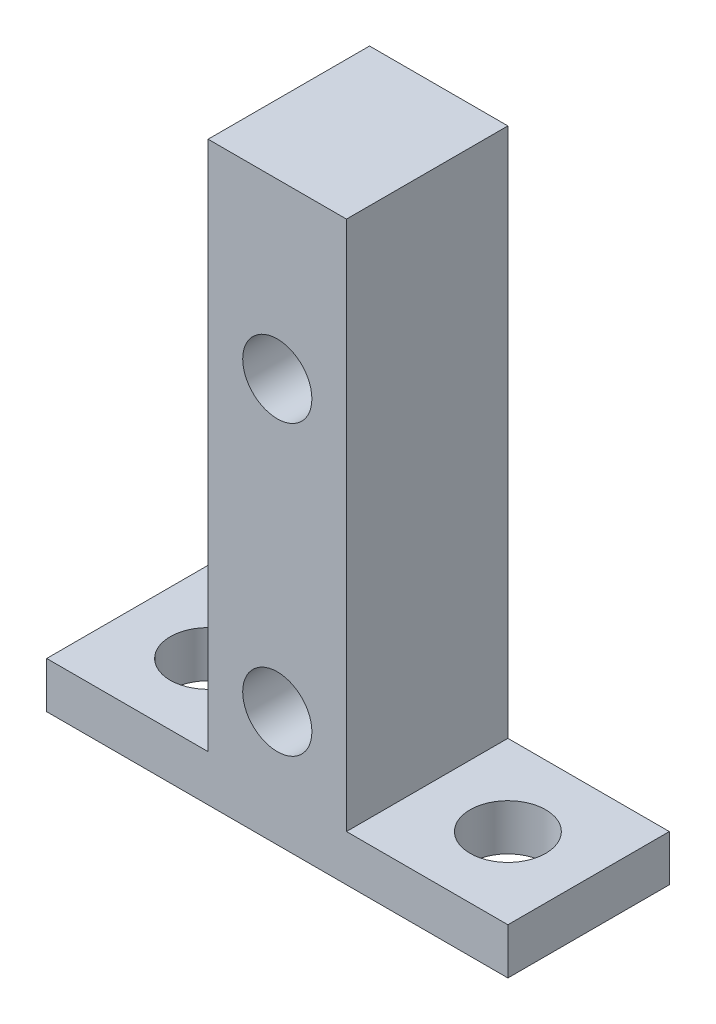
ISO-10303-21;
HEADER;
FILE_DESCRIPTION(('STEP AP214'),'2;1');
FILE_NAME('part.step','',(''),(''),'','','');
FILE_SCHEMA(('AUTOMOTIVE_DESIGN { 1 0 10303 214 1 1 1 1 }'));
ENDSEC;
DATA;
#1=APPLICATION_CONTEXT('core data for automotive mechanical design processes');
#2=APPLICATION_PROTOCOL_DEFINITION('international standard','automotive_design',2000,#1);
#3=PRODUCT_CONTEXT('',#1,'mechanical');
#4=PRODUCT('Part','Part','',(#3));
#5=PRODUCT_RELATED_PRODUCT_CATEGORY('part','',(#4));
#6=PRODUCT_DEFINITION_FORMATION('','',#4);
#7=PRODUCT_DEFINITION_CONTEXT('part definition',#1,'design');
#8=PRODUCT_DEFINITION('design','',#6,#7);
#9=PRODUCT_DEFINITION_SHAPE('','',#8);
#10=(LENGTH_UNIT() NAMED_UNIT(*) SI_UNIT(.MILLI.,.METRE.));
#11=(NAMED_UNIT(*) PLANE_ANGLE_UNIT() SI_UNIT($,.RADIAN.));
#12=(NAMED_UNIT(*) SI_UNIT($,.STERADIAN.) SOLID_ANGLE_UNIT());
#13=UNCERTAINTY_MEASURE_WITH_UNIT(LENGTH_MEASURE(1.E-05),#10,'distance_accuracy_value','');
#14=(GEOMETRIC_REPRESENTATION_CONTEXT(3) GLOBAL_UNCERTAINTY_ASSIGNED_CONTEXT((#13)) GLOBAL_UNIT_ASSIGNED_CONTEXT((#10,
#11,#12)) REPRESENTATION_CONTEXT('',''));
#15=CARTESIAN_POINT('',(0.,0.,0.));
#16=DIRECTION('',(0.,0.,1.));
#17=DIRECTION('',(1.,0.,0.));
#18=AXIS2_PLACEMENT_3D('',#15,#16,#17);
#19=CARTESIAN_POINT('',(-32.623125,3.175,0.));
#20=DIRECTION('',(0.,1.,0.));
#21=DIRECTION('',(0.,0.,1.));
#22=AXIS2_PLACEMENT_3D('',#19,#20,#21);
#23=PLANE('',#22);
#24=CARTESIAN_POINT('',(10.874375,3.175,26.67));
#25=DIRECTION('',(0.,1.,0.));
#26=DIRECTION('',(0.,0.,1.));
#27=AXIS2_PLACEMENT_3D('',#24,#25,#26);
#28=CIRCLE('',#27,2.0828);
#29=CARTESIAN_POINT('',(10.874375,3.175,28.7528));
#30=VERTEX_POINT('',#29);
#31=EDGE_CURVE('E11',#30,#30,#28,.F.);
#32=ORIENTED_EDGE('',*,*,#31,.F.);
#33=EDGE_LOOP('',(#32));
#34=FACE_BOUND('',#33,.T.);
#35=CARTESIAN_POINT('',(27.3843750000001,3.175,26.67));
#36=DIRECTION('',(0.,1.,0.));
#37=DIRECTION('',(0.,0.,1.));
#38=AXIS2_PLACEMENT_3D('',#35,#36,#37);
#39=CIRCLE('',#38,2.0828);
#40=CARTESIAN_POINT('',(27.3843750000001,3.175,28.7528));
#41=VERTEX_POINT('',#40);
#42=EDGE_CURVE('E43',#41,#41,#39,.F.);
#43=ORIENTED_EDGE('',*,*,#42,.F.);
#44=EDGE_LOOP('',(#43));
#45=FACE_BOUND('',#44,.T.);
#46=DIRECTION('',(1.,0.,0.));
#47=VECTOR('',#46,1.);
#48=CARTESIAN_POINT('',(22.939375,3.175,31.115));
#49=LINE('',#48,#47);
#50=CARTESIAN_POINT('',(6.42937500000001,3.175,31.115));
#51=VERTEX_POINT('',#50);
#52=CARTESIAN_POINT('',(31.829375,3.175,31.115));
#53=VERTEX_POINT('',#52);
#54=EDGE_CURVE('E142',#51,#53,#49,.T.);
#55=ORIENTED_EDGE('',*,*,#54,.F.);
#56=DIRECTION('',(0.,0.,1.));
#57=VECTOR('',#56,1.);
#58=CARTESIAN_POINT('',(6.42937500000001,3.175,31.115));
#59=LINE('',#58,#57);
#60=CARTESIAN_POINT('',(6.42937500000001,3.175,22.225));
#61=VERTEX_POINT('',#60);
#62=EDGE_CURVE('E121',#61,#51,#59,.T.);
#63=ORIENTED_EDGE('',*,*,#62,.F.);
#64=DIRECTION('',(-1.,0.,0.));
#65=VECTOR('',#64,1.);
#66=CARTESIAN_POINT('',(22.939375,3.175,22.225));
#67=LINE('',#66,#65);
#68=CARTESIAN_POINT('',(31.829375,3.175,22.225));
#69=VERTEX_POINT('',#68);
#70=EDGE_CURVE('E147',#69,#61,#67,.T.);
#71=ORIENTED_EDGE('',*,*,#70,.F.);
#72=DIRECTION('',(0.,0.,-1.));
#73=VECTOR('',#72,1.);
#74=CARTESIAN_POINT('',(31.829375,3.175,31.115));
#75=LINE('',#74,#73);
#76=EDGE_CURVE('E117',#53,#69,#75,.T.);
#77=ORIENTED_EDGE('',*,*,#76,.F.);
#78=EDGE_LOOP('',(#55,#63,#71,#77));
#79=FACE_BOUND('',#78,.T.);
#80=ADVANCED_FACE('F36',(#34,#45,#79),#23,.F.);
#81=CARTESIAN_POINT('',(0.,34.925,0.));
#82=DIRECTION('',(0.,1.,0.));
#83=DIRECTION('',(0.,0.,1.));
#84=AXIS2_PLACEMENT_3D('',#81,#82,#83);
#85=PLANE('',#84);
#86=DIRECTION('',(0.,0.,1.));
#87=VECTOR('',#86,1.);
#88=CARTESIAN_POINT('',(15.319375,34.925,31.115));
#89=LINE('',#88,#87);
#90=CARTESIAN_POINT('',(15.319375,34.925,22.225));
#91=VERTEX_POINT('',#90);
#92=CARTESIAN_POINT('',(15.319375,34.925,31.115));
#93=VERTEX_POINT('',#92);
#94=EDGE_CURVE('E143',#91,#93,#89,.T.);
#95=ORIENTED_EDGE('',*,*,#94,.T.);
#96=DIRECTION('',(1.,0.,0.));
#97=VECTOR('',#96,1.);
#98=CARTESIAN_POINT('',(22.939375,34.925,31.115));
#99=LINE('',#98,#97);
#100=CARTESIAN_POINT('',(22.939375,34.925,31.115));
#101=VERTEX_POINT('',#100);
#102=EDGE_CURVE('E146',#93,#101,#99,.T.);
#103=ORIENTED_EDGE('',*,*,#102,.T.);
#104=DIRECTION('',(0.,0.,-1.));
#105=VECTOR('',#104,1.);
#106=CARTESIAN_POINT('',(22.939375,34.925,31.115));
#107=LINE('',#106,#105);
#108=CARTESIAN_POINT('',(22.939375,34.925,22.225));
#109=VERTEX_POINT('',#108);
#110=EDGE_CURVE('E149',#101,#109,#107,.T.);
#111=ORIENTED_EDGE('',*,*,#110,.T.);
#112=DIRECTION('',(-1.,0.,0.));
#113=VECTOR('',#112,1.);
#114=CARTESIAN_POINT('',(22.939375,34.925,22.225));
#115=LINE('',#114,#113);
#116=EDGE_CURVE('E151',#109,#91,#115,.T.);
#117=ORIENTED_EDGE('',*,*,#116,.T.);
#118=EDGE_LOOP('',(#95,#103,#111,#117));
#119=FACE_BOUND('',#118,.T.);
#120=ADVANCED_FACE('F182',(#119),#85,.T.);
#121=CARTESIAN_POINT('',(15.319375,34.925,31.115));
#122=DIRECTION('',(1.,0.,0.));
#123=DIRECTION('',(0.,0.,-1.));
#124=AXIS2_PLACEMENT_3D('',#121,#122,#123);
#125=PLANE('',#124);
#126=DIRECTION('',(0.,-1.,0.));
#127=VECTOR('',#126,1.);
#128=CARTESIAN_POINT('',(15.319375,34.925,22.225));
#129=LINE('',#128,#127);
#130=CARTESIAN_POINT('',(15.319375,5.715,22.225));
#131=VERTEX_POINT('',#130);
#132=EDGE_CURVE('E153',#91,#131,#129,.T.);
#133=ORIENTED_EDGE('',*,*,#132,.T.);
#134=DIRECTION('',(0.,0.,1.));
#135=VECTOR('',#134,1.);
#136=CARTESIAN_POINT('',(15.319375,5.715,31.115));
#137=LINE('',#136,#135);
#138=CARTESIAN_POINT('',(15.319375,5.715,31.115));
#139=VERTEX_POINT('',#138);
#140=EDGE_CURVE('E126',#131,#139,#137,.T.);
#141=ORIENTED_EDGE('',*,*,#140,.T.);
#142=DIRECTION('',(0.,-1.,0.));
#143=VECTOR('',#142,1.);
#144=CARTESIAN_POINT('',(15.319375,34.925,31.115));
#145=LINE('',#144,#143);
#146=EDGE_CURVE('E105',#93,#139,#145,.T.);
#147=ORIENTED_EDGE('',*,*,#146,.F.);
#148=ORIENTED_EDGE('',*,*,#94,.F.);
#149=EDGE_LOOP('',(#133,#141,#147,#148));
#150=FACE_BOUND('',#149,.T.);
#151=ADVANCED_FACE('F211',(#150),#125,.F.);
#152=CARTESIAN_POINT('',(22.939375,34.925,31.115));
#153=DIRECTION('',(-1.,0.,0.));
#154=DIRECTION('',(0.,0.,1.));
#155=AXIS2_PLACEMENT_3D('',#152,#153,#154);
#156=PLANE('',#155);
#157=DIRECTION('',(0.,-1.,0.));
#158=VECTOR('',#157,1.);
#159=CARTESIAN_POINT('',(22.939375,34.925,31.115));
#160=LINE('',#159,#158);
#161=CARTESIAN_POINT('',(22.939375,5.715,31.115));
#162=VERTEX_POINT('',#161);
#163=EDGE_CURVE('E161',#101,#162,#160,.T.);
#164=ORIENTED_EDGE('',*,*,#163,.T.);
#165=DIRECTION('',(0.,0.,-1.));
#166=VECTOR('',#165,1.);
#167=CARTESIAN_POINT('',(22.939375,5.715,31.115));
#168=LINE('',#167,#166);
#169=CARTESIAN_POINT('',(22.939375,5.715,22.225));
#170=VERTEX_POINT('',#169);
#171=EDGE_CURVE('E123',#162,#170,#168,.T.);
#172=ORIENTED_EDGE('',*,*,#171,.T.);
#173=DIRECTION('',(0.,-1.,0.));
#174=VECTOR('',#173,1.);
#175=CARTESIAN_POINT('',(22.939375,34.925,22.225));
#176=LINE('',#175,#174);
#177=EDGE_CURVE('E158',#109,#170,#176,.T.);
#178=ORIENTED_EDGE('',*,*,#177,.F.);
#179=ORIENTED_EDGE('',*,*,#110,.F.);
#180=EDGE_LOOP('',(#164,#172,#178,#179));
#181=FACE_BOUND('',#180,.T.);
#182=ADVANCED_FACE('F205',(#181),#156,.F.);
#183=CARTESIAN_POINT('',(19.129375,25.4,0.));
#184=DIRECTION('',(0.,0.,1.));
#185=DIRECTION('',(1.,0.,0.));
#186=AXIS2_PLACEMENT_3D('',#183,#184,#185);
#187=CYLINDRICAL_SURFACE('',#186,1.905);
#188=CARTESIAN_POINT('',(19.129375,25.4,22.225));
#189=DIRECTION('',(0.,0.,1.));
#190=DIRECTION('',(1.,0.,0.));
#191=AXIS2_PLACEMENT_3D('',#188,#189,#190);
#192=CIRCLE('',#191,1.905);
#193=CARTESIAN_POINT('',(21.034375,25.4,22.225));
#194=VERTEX_POINT('',#193);
#195=EDGE_CURVE('E134',#194,#194,#192,.T.);
#196=ORIENTED_EDGE('',*,*,#195,.F.);
#197=EDGE_LOOP('',(#196));
#198=FACE_BOUND('',#197,.T.);
#199=CARTESIAN_POINT('',(19.129375,25.4,31.115));
#200=DIRECTION('',(0.,0.,-1.));
#201=DIRECTION('',(-1.,0.,0.));
#202=AXIS2_PLACEMENT_3D('',#199,#200,#201);
#203=CIRCLE('',#202,1.905);
#204=CARTESIAN_POINT('',(17.224375,25.4,31.115));
#205=VERTEX_POINT('',#204);
#206=EDGE_CURVE('E135',#205,#205,#203,.T.);
#207=ORIENTED_EDGE('',*,*,#206,.F.);
#208=EDGE_LOOP('',(#207));
#209=FACE_BOUND('',#208,.T.);
#210=ADVANCED_FACE('F217',(#198,#209),#187,.F.);
#211=CARTESIAN_POINT('',(19.129375,9.525,0.));
#212=DIRECTION('',(0.,0.,1.));
#213=DIRECTION('',(1.,0.,0.));
#214=AXIS2_PLACEMENT_3D('',#211,#212,#213);
#215=CYLINDRICAL_SURFACE('',#214,1.905);
#216=CARTESIAN_POINT('',(19.129375,9.525,22.225));
#217=DIRECTION('',(0.,0.,1.));
#218=DIRECTION('',(1.,0.,0.));
#219=AXIS2_PLACEMENT_3D('',#216,#217,#218);
#220=CIRCLE('',#219,1.905);
#221=CARTESIAN_POINT('',(21.034375,9.525,22.225));
#222=VERTEX_POINT('',#221);
#223=EDGE_CURVE('E138',#222,#222,#220,.T.);
#224=ORIENTED_EDGE('',*,*,#223,.F.);
#225=EDGE_LOOP('',(#224));
#226=FACE_BOUND('',#225,.T.);
#227=CARTESIAN_POINT('',(19.129375,9.525,31.115));
#228=DIRECTION('',(0.,0.,-1.));
#229=DIRECTION('',(-1.,0.,0.));
#230=AXIS2_PLACEMENT_3D('',#227,#228,#229);
#231=CIRCLE('',#230,1.905);
#232=CARTESIAN_POINT('',(17.224375,9.525,31.115));
#233=VERTEX_POINT('',#232);
#234=EDGE_CURVE('E139',#233,#233,#231,.T.);
#235=ORIENTED_EDGE('',*,*,#234,.F.);
#236=EDGE_LOOP('',(#235));
#237=FACE_BOUND('',#236,.T.);
#238=ADVANCED_FACE('F230',(#226,#237),#215,.F.);
#239=CARTESIAN_POINT('',(0.,5.715,0.));
#240=DIRECTION('',(0.,1.,0.));
#241=DIRECTION('',(0.,0.,1.));
#242=AXIS2_PLACEMENT_3D('',#239,#240,#241);
#243=PLANE('',#242);
#244=CARTESIAN_POINT('',(27.3843750000001,5.715,26.67));
#245=DIRECTION('',(0.,1.,0.));
#246=DIRECTION('',(0.,0.,1.));
#247=AXIS2_PLACEMENT_3D('',#244,#245,#246);
#248=CIRCLE('',#247,2.0828);
#249=CARTESIAN_POINT('',(27.3843750000001,5.715,28.7528));
#250=VERTEX_POINT('',#249);
#251=EDGE_CURVE('E172',#250,#250,#248,.T.);
#252=ORIENTED_EDGE('',*,*,#251,.F.);
#253=EDGE_LOOP('',(#252));
#254=FACE_BOUND('',#253,.T.);
#255=ORIENTED_EDGE('',*,*,#171,.F.);
#256=DIRECTION('',(1.,0.,0.));
#257=VECTOR('',#256,1.);
#258=CARTESIAN_POINT('',(31.829375,5.715,31.115));
#259=LINE('',#258,#257);
#260=CARTESIAN_POINT('',(31.829375,5.715,31.115));
#261=VERTEX_POINT('',#260);
#262=EDGE_CURVE('E107',#162,#261,#259,.T.);
#263=ORIENTED_EDGE('',*,*,#262,.T.);
#264=DIRECTION('',(0.,0.,-1.));
#265=VECTOR('',#264,1.);
#266=CARTESIAN_POINT('',(31.829375,5.715,31.115));
#267=LINE('',#266,#265);
#268=CARTESIAN_POINT('',(31.829375,5.715,22.225));
#269=VERTEX_POINT('',#268);
#270=EDGE_CURVE('E106',#261,#269,#267,.T.);
#271=ORIENTED_EDGE('',*,*,#270,.T.);
#272=DIRECTION('',(-1.,0.,0.));
#273=VECTOR('',#272,1.);
#274=CARTESIAN_POINT('',(31.829375,5.715,22.225));
#275=LINE('',#274,#273);
#276=EDGE_CURVE('E58',#269,#170,#275,.T.);
#277=ORIENTED_EDGE('',*,*,#276,.T.);
#278=EDGE_LOOP('',(#255,#263,#271,#277));
#279=FACE_BOUND('',#278,.T.);
#280=ADVANCED_FACE('F207',(#254,#279),#243,.T.);
#281=CARTESIAN_POINT('',(27.3843750000001,-13.17625,26.67));
#282=DIRECTION('',(0.,1.,0.));
#283=DIRECTION('',(0.,0.,1.));
#284=AXIS2_PLACEMENT_3D('',#281,#282,#283);
#285=CYLINDRICAL_SURFACE('',#284,2.0828);
#286=ORIENTED_EDGE('',*,*,#42,.T.);
#287=EDGE_LOOP('',(#286));
#288=FACE_BOUND('',#287,.T.);
#289=ORIENTED_EDGE('',*,*,#251,.T.);
#290=EDGE_LOOP('',(#289));
#291=FACE_BOUND('',#290,.T.);
#292=ADVANCED_FACE('F177',(#288,#291),#285,.F.);
#293=CARTESIAN_POINT('',(22.939375,34.925,22.225));
#294=DIRECTION('',(0.,0.,1.));
#295=DIRECTION('',(1.,0.,0.));
#296=AXIS2_PLACEMENT_3D('',#293,#294,#295);
#297=PLANE('',#296);
#298=ORIENTED_EDGE('',*,*,#223,.T.);
#299=EDGE_LOOP('',(#298));
#300=FACE_BOUND('',#299,.T.);
#301=ORIENTED_EDGE('',*,*,#195,.T.);
#302=EDGE_LOOP('',(#301));
#303=FACE_BOUND('',#302,.T.);
#304=ORIENTED_EDGE('',*,*,#177,.T.);
#305=ORIENTED_EDGE('',*,*,#276,.F.);
#306=DIRECTION('',(0.,-1.,0.));
#307=VECTOR('',#306,1.);
#308=CARTESIAN_POINT('',(31.829375,5.715,22.225));
#309=LINE('',#308,#307);
#310=EDGE_CURVE('E129',#269,#69,#309,.T.);
#311=ORIENTED_EDGE('',*,*,#310,.T.);
#312=ORIENTED_EDGE('',*,*,#70,.T.);
#313=DIRECTION('',(0.,-1.,0.));
#314=VECTOR('',#313,1.);
#315=CARTESIAN_POINT('',(6.42937500000001,5.715,22.225));
#316=LINE('',#315,#314);
#317=CARTESIAN_POINT('',(6.42937500000001,5.715,22.225));
#318=VERTEX_POINT('',#317);
#319=EDGE_CURVE('E195',#318,#61,#316,.T.);
#320=ORIENTED_EDGE('',*,*,#319,.F.);
#321=EDGE_CURVE('E113',#131,#318,#275,.T.);
#322=ORIENTED_EDGE('',*,*,#321,.F.);
#323=ORIENTED_EDGE('',*,*,#132,.F.);
#324=ORIENTED_EDGE('',*,*,#116,.F.);
#325=EDGE_LOOP('',(#304,#305,#311,#312,#320,#322,#323,#324));
#326=FACE_BOUND('',#325,.T.);
#327=ADVANCED_FACE('F199',(#300,#303,#326),#297,.F.);
#328=CARTESIAN_POINT('',(10.874375,5.715,26.67));
#329=DIRECTION('',(0.,1.,0.));
#330=DIRECTION('',(0.,0.,1.));
#331=AXIS2_PLACEMENT_3D('',#328,#329,#330);
#332=CIRCLE('',#331,2.0828);
#333=CARTESIAN_POINT('',(10.874375,5.715,28.7528));
#334=VERTEX_POINT('',#333);
#335=EDGE_CURVE('E169',#334,#334,#332,.T.);
#336=ORIENTED_EDGE('',*,*,#335,.F.);
#337=EDGE_LOOP('',(#336));
#338=FACE_BOUND('',#337,.T.);
#339=ORIENTED_EDGE('',*,*,#140,.F.);
#340=ORIENTED_EDGE('',*,*,#321,.T.);
#341=DIRECTION('',(0.,0.,1.));
#342=VECTOR('',#341,1.);
#343=CARTESIAN_POINT('',(6.42937500000001,5.715,31.115));
#344=LINE('',#343,#342);
#345=CARTESIAN_POINT('',(6.42937500000001,5.715,31.115));
#346=VERTEX_POINT('',#345);
#347=EDGE_CURVE('E110',#318,#346,#344,.T.);
#348=ORIENTED_EDGE('',*,*,#347,.T.);
#349=EDGE_CURVE('E50',#346,#139,#259,.T.);
#350=ORIENTED_EDGE('',*,*,#349,.T.);
#351=EDGE_LOOP('',(#339,#340,#348,#350));
#352=FACE_BOUND('',#351,.T.);
#353=ADVANCED_FACE('F111',(#338,#352),#243,.T.);
#354=CARTESIAN_POINT('',(10.874375,-13.17625,26.67));
#355=DIRECTION('',(0.,1.,0.));
#356=DIRECTION('',(0.,0.,1.));
#357=AXIS2_PLACEMENT_3D('',#354,#355,#356);
#358=CYLINDRICAL_SURFACE('',#357,2.0828);
#359=ORIENTED_EDGE('',*,*,#31,.T.);
#360=EDGE_LOOP('',(#359));
#361=FACE_BOUND('',#360,.T.);
#362=ORIENTED_EDGE('',*,*,#335,.T.);
#363=EDGE_LOOP('',(#362));
#364=FACE_BOUND('',#363,.T.);
#365=ADVANCED_FACE('F222',(#361,#364),#358,.F.);
#366=CARTESIAN_POINT('',(22.939375,34.925,31.115));
#367=DIRECTION('',(0.,0.,-1.));
#368=DIRECTION('',(-1.,0.,0.));
#369=AXIS2_PLACEMENT_3D('',#366,#367,#368);
#370=PLANE('',#369);
#371=ORIENTED_EDGE('',*,*,#234,.T.);
#372=EDGE_LOOP('',(#371));
#373=FACE_BOUND('',#372,.T.);
#374=ORIENTED_EDGE('',*,*,#206,.T.);
#375=EDGE_LOOP('',(#374));
#376=FACE_BOUND('',#375,.T.);
#377=ORIENTED_EDGE('',*,*,#146,.T.);
#378=ORIENTED_EDGE('',*,*,#349,.F.);
#379=DIRECTION('',(0.,-1.,0.));
#380=VECTOR('',#379,1.);
#381=CARTESIAN_POINT('',(6.42937500000001,5.715,31.115));
#382=LINE('',#381,#380);
#383=EDGE_CURVE('E103',#346,#51,#382,.T.);
#384=ORIENTED_EDGE('',*,*,#383,.T.);
#385=ORIENTED_EDGE('',*,*,#54,.T.);
#386=DIRECTION('',(0.,-1.,0.));
#387=VECTOR('',#386,1.);
#388=CARTESIAN_POINT('',(31.829375,5.715,31.115));
#389=LINE('',#388,#387);
#390=EDGE_CURVE('E124',#261,#53,#389,.T.);
#391=ORIENTED_EDGE('',*,*,#390,.F.);
#392=ORIENTED_EDGE('',*,*,#262,.F.);
#393=ORIENTED_EDGE('',*,*,#163,.F.);
#394=ORIENTED_EDGE('',*,*,#102,.F.);
#395=EDGE_LOOP('',(#377,#378,#384,#385,#391,#392,#393,#394));
#396=FACE_BOUND('',#395,.T.);
#397=ADVANCED_FACE('F100',(#373,#376,#396),#370,.F.);
#398=CARTESIAN_POINT('',(6.42937500000001,5.715,31.115));
#399=DIRECTION('',(1.,0.,0.));
#400=DIRECTION('',(0.,0.,-1.));
#401=AXIS2_PLACEMENT_3D('',#398,#399,#400);
#402=PLANE('',#401);
#403=ORIENTED_EDGE('',*,*,#62,.T.);
#404=ORIENTED_EDGE('',*,*,#383,.F.);
#405=ORIENTED_EDGE('',*,*,#347,.F.);
#406=ORIENTED_EDGE('',*,*,#319,.T.);
#407=EDGE_LOOP('',(#403,#404,#405,#406));
#408=FACE_BOUND('',#407,.T.);
#409=ADVANCED_FACE('F119',(#408),#402,.F.);
#410=CARTESIAN_POINT('',(31.829375,5.715,31.115));
#411=DIRECTION('',(-1.,0.,0.));
#412=DIRECTION('',(0.,0.,1.));
#413=AXIS2_PLACEMENT_3D('',#410,#411,#412);
#414=PLANE('',#413);
#415=ORIENTED_EDGE('',*,*,#76,.T.);
#416=ORIENTED_EDGE('',*,*,#310,.F.);
#417=ORIENTED_EDGE('',*,*,#270,.F.);
#418=ORIENTED_EDGE('',*,*,#390,.T.);
#419=EDGE_LOOP('',(#415,#416,#417,#418));
#420=FACE_BOUND('',#419,.T.);
#421=ADVANCED_FACE('F184',(#420),#414,.F.);
#422=CLOSED_SHELL('',(#80,#120,#151,#182,#210,#238,#280,#292,#327,#353,#365,#397,#409,#421));
#423=MANIFOLD_SOLID_BREP('B2',#422);
#424=ADVANCED_BREP_SHAPE_REPRESENTATION('',(#18,#423),#14);
#425=SHAPE_DEFINITION_REPRESENTATION(#9,#424);
ENDSEC;
END-ISO-10303-21;
